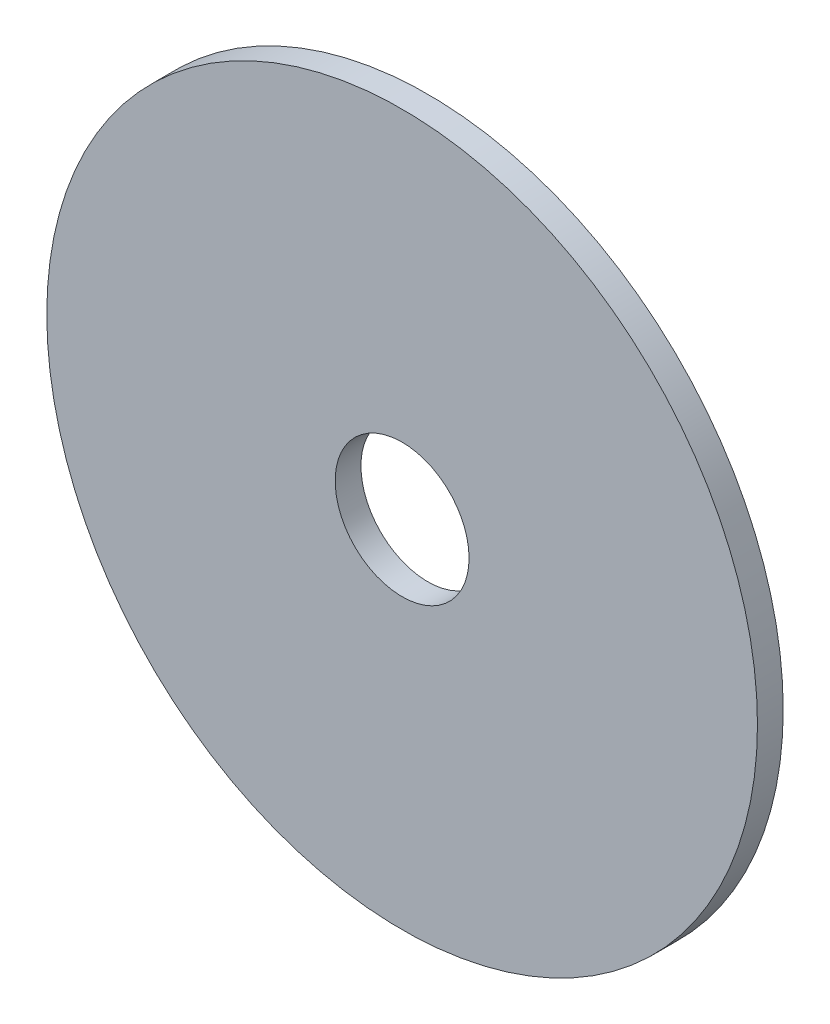
ISO-10303-21;
HEADER;
FILE_DESCRIPTION(('STEP AP214'),'2;1');
FILE_NAME('part.step','',(''),(''),'','','');
FILE_SCHEMA(('AUTOMOTIVE_DESIGN { 1 0 10303 214 1 1 1 1 }'));
ENDSEC;
DATA;
#1=APPLICATION_CONTEXT('core data for automotive mechanical design processes');
#2=APPLICATION_PROTOCOL_DEFINITION('international standard','automotive_design',2000,#1);
#3=PRODUCT_CONTEXT('',#1,'mechanical');
#4=PRODUCT('Part','Part','',(#3));
#5=PRODUCT_RELATED_PRODUCT_CATEGORY('part','',(#4));
#6=PRODUCT_DEFINITION_FORMATION('','',#4);
#7=PRODUCT_DEFINITION_CONTEXT('part definition',#1,'design');
#8=PRODUCT_DEFINITION('design','',#6,#7);
#9=PRODUCT_DEFINITION_SHAPE('','',#8);
#10=(LENGTH_UNIT() NAMED_UNIT(*) SI_UNIT(.MILLI.,.METRE.));
#11=(NAMED_UNIT(*) PLANE_ANGLE_UNIT() SI_UNIT($,.RADIAN.));
#12=(NAMED_UNIT(*) SI_UNIT($,.STERADIAN.) SOLID_ANGLE_UNIT());
#13=UNCERTAINTY_MEASURE_WITH_UNIT(LENGTH_MEASURE(1.E-05),#10,'distance_accuracy_value','');
#14=(GEOMETRIC_REPRESENTATION_CONTEXT(3) GLOBAL_UNCERTAINTY_ASSIGNED_CONTEXT((#13)) GLOBAL_UNIT_ASSIGNED_CONTEXT((#10,
#11,#12)) REPRESENTATION_CONTEXT('',''));
#15=CARTESIAN_POINT('',(0.,0.,0.));
#16=DIRECTION('',(0.,0.,1.));
#17=DIRECTION('',(1.,0.,0.));
#18=AXIS2_PLACEMENT_3D('',#15,#16,#17);
#19=CARTESIAN_POINT('',(0.,0.,0.635));
#20=DIRECTION('',(0.,0.,1.));
#21=DIRECTION('',(1.,0.,0.));
#22=AXIS2_PLACEMENT_3D('',#19,#20,#21);
#23=PLANE('',#22);
#24=CARTESIAN_POINT('',(0.,0.,0.635));
#25=DIRECTION('',(0.,0.,1.));
#26=DIRECTION('',(1.,0.,0.));
#27=AXIS2_PLACEMENT_3D('',#24,#25,#26);
#28=CIRCLE('',#27,17.526);
#29=CARTESIAN_POINT('',(17.526,0.,0.635));
#30=VERTEX_POINT('',#29);
#31=EDGE_CURVE('E10',#30,#30,#28,.T.);
#32=ORIENTED_EDGE('',*,*,#31,.T.);
#33=EDGE_LOOP('',(#32));
#34=FACE_BOUND('',#33,.T.);
#35=CARTESIAN_POINT('',(0.,0.,0.635));
#36=DIRECTION('',(0.,0.,1.));
#37=DIRECTION('',(1.,0.,0.));
#38=AXIS2_PLACEMENT_3D('',#35,#36,#37);
#39=CIRCLE('',#38,3.302);
#40=CARTESIAN_POINT('',(3.302,0.,0.635));
#41=VERTEX_POINT('',#40);
#42=EDGE_CURVE('E43',#41,#41,#39,.T.);
#43=ORIENTED_EDGE('',*,*,#42,.F.);
#44=EDGE_LOOP('',(#43));
#45=FACE_BOUND('',#44,.T.);
#46=ADVANCED_FACE('F32',(#34,#45),#23,.T.);
#47=CARTESIAN_POINT('',(0.,0.,-0.635));
#48=DIRECTION('',(0.,0.,1.));
#49=DIRECTION('',(1.,0.,0.));
#50=AXIS2_PLACEMENT_3D('',#47,#48,#49);
#51=PLANE('',#50);
#52=CARTESIAN_POINT('',(0.,0.,-0.635));
#53=DIRECTION('',(0.,0.,1.));
#54=DIRECTION('',(1.,0.,0.));
#55=AXIS2_PLACEMENT_3D('',#52,#53,#54);
#56=CIRCLE('',#55,17.526);
#57=CARTESIAN_POINT('',(17.526,0.,-0.635));
#58=VERTEX_POINT('',#57);
#59=EDGE_CURVE('E36',#58,#58,#56,.T.);
#60=ORIENTED_EDGE('',*,*,#59,.F.);
#61=EDGE_LOOP('',(#60));
#62=FACE_BOUND('',#61,.T.);
#63=CARTESIAN_POINT('',(0.,0.,-0.635));
#64=DIRECTION('',(0.,0.,1.));
#65=DIRECTION('',(1.,0.,0.));
#66=AXIS2_PLACEMENT_3D('',#63,#64,#65);
#67=CIRCLE('',#66,3.302);
#68=CARTESIAN_POINT('',(3.302,0.,-0.635));
#69=VERTEX_POINT('',#68);
#70=EDGE_CURVE('E45',#69,#69,#67,.T.);
#71=ORIENTED_EDGE('',*,*,#70,.T.);
#72=EDGE_LOOP('',(#71));
#73=FACE_BOUND('',#72,.T.);
#74=ADVANCED_FACE('F55',(#62,#73),#51,.F.);
#75=CARTESIAN_POINT('',(0.,0.,0.635));
#76=DIRECTION('',(0.,0.,-1.));
#77=DIRECTION('',(-1.,0.,0.));
#78=AXIS2_PLACEMENT_3D('',#75,#76,#77);
#79=CYLINDRICAL_SURFACE('',#78,17.526);
#80=ORIENTED_EDGE('',*,*,#31,.F.);
#81=EDGE_LOOP('',(#80));
#82=FACE_BOUND('',#81,.T.);
#83=ORIENTED_EDGE('',*,*,#59,.T.);
#84=EDGE_LOOP('',(#83));
#85=FACE_BOUND('',#84,.T.);
#86=ADVANCED_FACE('F34',(#82,#85),#79,.T.);
#87=CARTESIAN_POINT('',(0.,0.,0.635));
#88=DIRECTION('',(0.,0.,-1.));
#89=DIRECTION('',(-1.,0.,0.));
#90=AXIS2_PLACEMENT_3D('',#87,#88,#89);
#91=CYLINDRICAL_SURFACE('',#90,3.302);
#92=ORIENTED_EDGE('',*,*,#42,.T.);
#93=EDGE_LOOP('',(#92));
#94=FACE_BOUND('',#93,.T.);
#95=ORIENTED_EDGE('',*,*,#70,.F.);
#96=EDGE_LOOP('',(#95));
#97=FACE_BOUND('',#96,.T.);
#98=ADVANCED_FACE('F51',(#94,#97),#91,.F.);
#99=CLOSED_SHELL('',(#46,#74,#86,#98));
#100=MANIFOLD_SOLID_BREP('B2',#99);
#101=ADVANCED_BREP_SHAPE_REPRESENTATION('',(#18,#100),#14);
#102=SHAPE_DEFINITION_REPRESENTATION(#9,#101);
ENDSEC;
END-ISO-10303-21;
